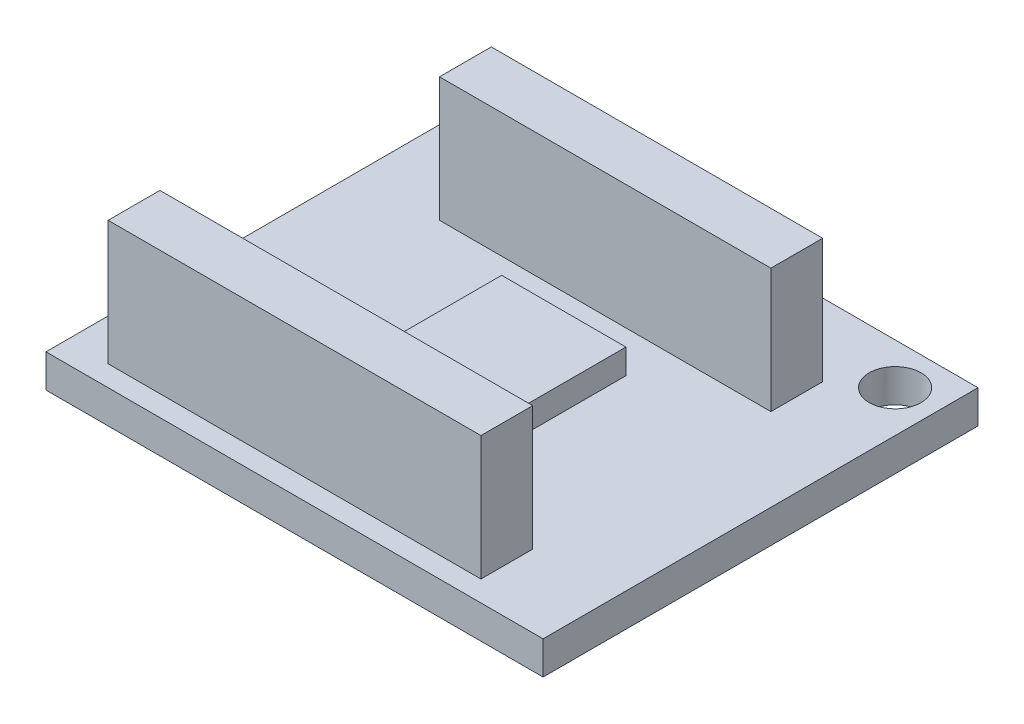
ISO-10303-21;
HEADER;
FILE_DESCRIPTION(('STEP AP214'),'2;1');
FILE_NAME('part.step','',(''),(''),'','','');
FILE_SCHEMA(('AUTOMOTIVE_DESIGN { 1 0 10303 214 1 1 1 1 }'));
ENDSEC;
DATA;
#1=APPLICATION_CONTEXT('core data for automotive mechanical design processes');
#2=APPLICATION_PROTOCOL_DEFINITION('international standard','automotive_design',2000,#1);
#3=PRODUCT_CONTEXT('',#1,'mechanical');
#4=PRODUCT('Part','Part','',(#3));
#5=PRODUCT_RELATED_PRODUCT_CATEGORY('part','',(#4));
#6=PRODUCT_DEFINITION_FORMATION('','',#4);
#7=PRODUCT_DEFINITION_CONTEXT('part definition',#1,'design');
#8=PRODUCT_DEFINITION('design','',#6,#7);
#9=PRODUCT_DEFINITION_SHAPE('','',#8);
#10=(LENGTH_UNIT() NAMED_UNIT(*) SI_UNIT(.MILLI.,.METRE.));
#11=(NAMED_UNIT(*) PLANE_ANGLE_UNIT() SI_UNIT($,.RADIAN.));
#12=(NAMED_UNIT(*) SI_UNIT($,.STERADIAN.) SOLID_ANGLE_UNIT());
#13=UNCERTAINTY_MEASURE_WITH_UNIT(LENGTH_MEASURE(1.E-05),#10,'distance_accuracy_value','');
#14=(GEOMETRIC_REPRESENTATION_CONTEXT(3) GLOBAL_UNCERTAINTY_ASSIGNED_CONTEXT((#13)) GLOBAL_UNIT_ASSIGNED_CONTEXT((#10,
#11,#12)) REPRESENTATION_CONTEXT('',''));
#15=CARTESIAN_POINT('',(0.,0.,0.));
#16=DIRECTION('',(0.,0.,1.));
#17=DIRECTION('',(1.,0.,0.));
#18=AXIS2_PLACEMENT_3D('',#15,#16,#17);
#19=CARTESIAN_POINT('',(0.,1.6,0.));
#20=DIRECTION('',(0.,-1.,0.));
#21=DIRECTION('',(0.,0.,-1.));
#22=AXIS2_PLACEMENT_3D('',#19,#20,#21);
#23=PLANE('',#22);
#24=DIRECTION('',(0.,0.,1.));
#25=VECTOR('',#24,1.);
#26=CARTESIAN_POINT('',(2.,1.6,-1.));
#27=LINE('',#26,#25);
#28=CARTESIAN_POINT('',(2.,1.6,-3.5));
#29=VERTEX_POINT('',#28);
#30=CARTESIAN_POINT('',(2.,1.6,-1.));
#31=VERTEX_POINT('',#30);
#32=EDGE_CURVE('E193',#29,#31,#27,.T.);
#33=ORIENTED_EDGE('',*,*,#32,.F.);
#34=DIRECTION('',(-1.,0.,0.));
#35=VECTOR('',#34,1.);
#36=CARTESIAN_POINT('',(2.,1.6,-3.5));
#37=LINE('',#36,#35);
#38=CARTESIAN_POINT('',(20.,1.6,-3.5));
#39=VERTEX_POINT('',#38);
#40=EDGE_CURVE('E210',#39,#29,#37,.T.);
#41=ORIENTED_EDGE('',*,*,#40,.F.);
#42=DIRECTION('',(0.,0.,-1.));
#43=VECTOR('',#42,1.);
#44=CARTESIAN_POINT('',(20.,1.6,-1.));
#45=LINE('',#44,#43);
#46=CARTESIAN_POINT('',(20.,1.6,-1.));
#47=VERTEX_POINT('',#46);
#48=EDGE_CURVE('E219',#47,#39,#45,.T.);
#49=ORIENTED_EDGE('',*,*,#48,.F.);
#50=DIRECTION('',(1.,0.,0.));
#51=VECTOR('',#50,1.);
#52=CARTESIAN_POINT('',(2.,1.6,-1.));
#53=LINE('',#52,#51);
#54=EDGE_CURVE('E198',#31,#47,#53,.T.);
#55=ORIENTED_EDGE('',*,*,#54,.F.);
#56=EDGE_LOOP('',(#33,#41,#49,#55));
#57=FACE_BOUND('',#56,.T.);
#58=DIRECTION('',(0.,0.,1.));
#59=VECTOR('',#58,1.);
#60=CARTESIAN_POINT('',(0.,1.6,0.));
#61=LINE('',#60,#59);
#62=CARTESIAN_POINT('',(0.,1.6,-21.));
#63=VERTEX_POINT('',#62);
#64=CARTESIAN_POINT('',(0.,1.6,0.));
#65=VERTEX_POINT('',#64);
#66=EDGE_CURVE('E306',#63,#65,#61,.T.);
#67=ORIENTED_EDGE('',*,*,#66,.T.);
#68=DIRECTION('',(1.,0.,0.));
#69=VECTOR('',#68,1.);
#70=CARTESIAN_POINT('',(0.,1.6,0.));
#71=LINE('',#70,#69);
#72=CARTESIAN_POINT('',(24.,1.6,0.));
#73=VERTEX_POINT('',#72);
#74=EDGE_CURVE('E382',#65,#73,#71,.T.);
#75=ORIENTED_EDGE('',*,*,#74,.T.);
#76=DIRECTION('',(0.,0.,-1.));
#77=VECTOR('',#76,1.);
#78=CARTESIAN_POINT('',(24.,1.6,0.));
#79=LINE('',#78,#77);
#80=CARTESIAN_POINT('',(24.,1.6,-21.));
#81=VERTEX_POINT('',#80);
#82=EDGE_CURVE('E356',#73,#81,#79,.T.);
#83=ORIENTED_EDGE('',*,*,#82,.T.);
#84=DIRECTION('',(-1.,0.,0.));
#85=VECTOR('',#84,1.);
#86=CARTESIAN_POINT('',(0.,1.6,-21.));
#87=LINE('',#86,#85);
#88=EDGE_CURVE('E374',#81,#63,#87,.T.);
#89=ORIENTED_EDGE('',*,*,#88,.T.);
#90=EDGE_LOOP('',(#67,#75,#83,#89));
#91=FACE_BOUND('',#90,.T.);
#92=CARTESIAN_POINT('',(2.,1.6,-19.));
#93=DIRECTION('',(0.,1.,0.));
#94=DIRECTION('',(0.,0.,1.));
#95=AXIS2_PLACEMENT_3D('',#92,#93,#94);
#96=CIRCLE('',#95,1.25);
#97=CARTESIAN_POINT('',(2.,1.6,-17.75));
#98=VERTEX_POINT('',#97);
#99=EDGE_CURVE('E293',#98,#98,#96,.T.);
#100=ORIENTED_EDGE('',*,*,#99,.F.);
#101=EDGE_LOOP('',(#100));
#102=FACE_BOUND('',#101,.T.);
#103=CARTESIAN_POINT('',(22.,1.6,-19.));
#104=DIRECTION('',(0.,1.,0.));
#105=DIRECTION('',(0.,0.,1.));
#106=AXIS2_PLACEMENT_3D('',#103,#104,#105);
#107=CIRCLE('',#106,1.25);
#108=CARTESIAN_POINT('',(22.,1.6,-17.75));
#109=VERTEX_POINT('',#108);
#110=EDGE_CURVE('E290',#109,#109,#107,.T.);
#111=ORIENTED_EDGE('',*,*,#110,.F.);
#112=EDGE_LOOP('',(#111));
#113=FACE_BOUND('',#112,.T.);
#114=DIRECTION('',(0.,0.,1.));
#115=VECTOR('',#114,1.);
#116=CARTESIAN_POINT('',(9.,1.6,-8.));
#117=LINE('',#116,#115);
#118=CARTESIAN_POINT('',(9.,1.6,-13.));
#119=VERTEX_POINT('',#118);
#120=CARTESIAN_POINT('',(9.,1.6,-8.));
#121=VERTEX_POINT('',#120);
#122=EDGE_CURVE('E245',#119,#121,#117,.T.);
#123=ORIENTED_EDGE('',*,*,#122,.F.);
#124=DIRECTION('',(-1.,0.,0.));
#125=VECTOR('',#124,1.);
#126=CARTESIAN_POINT('',(9.,1.6,-13.));
#127=LINE('',#126,#125);
#128=CARTESIAN_POINT('',(15.,1.6,-13.));
#129=VERTEX_POINT('',#128);
#130=EDGE_CURVE('E246',#129,#119,#127,.T.);
#131=ORIENTED_EDGE('',*,*,#130,.F.);
#132=DIRECTION('',(0.,0.,-1.));
#133=VECTOR('',#132,1.);
#134=CARTESIAN_POINT('',(15.,1.6,-8.));
#135=LINE('',#134,#133);
#136=CARTESIAN_POINT('',(15.,1.6,-8.));
#137=VERTEX_POINT('',#136);
#138=EDGE_CURVE('E264',#137,#129,#135,.T.);
#139=ORIENTED_EDGE('',*,*,#138,.F.);
#140=DIRECTION('',(1.,0.,0.));
#141=VECTOR('',#140,1.);
#142=CARTESIAN_POINT('',(9.,1.6,-8.));
#143=LINE('',#142,#141);
#144=EDGE_CURVE('E261',#121,#137,#143,.T.);
#145=ORIENTED_EDGE('',*,*,#144,.F.);
#146=EDGE_LOOP('',(#123,#131,#139,#145));
#147=FACE_BOUND('',#146,.T.);
#148=DIRECTION('',(0.,0.,1.));
#149=VECTOR('',#148,1.);
#150=CARTESIAN_POINT('',(4.,1.6,-15.));
#151=LINE('',#150,#149);
#152=CARTESIAN_POINT('',(4.,1.6,-17.5));
#153=VERTEX_POINT('',#152);
#154=CARTESIAN_POINT('',(4.,1.6,-15.));
#155=VERTEX_POINT('',#154);
#156=EDGE_CURVE('E188',#153,#155,#151,.T.);
#157=ORIENTED_EDGE('',*,*,#156,.F.);
#158=DIRECTION('',(-1.,0.,0.));
#159=VECTOR('',#158,1.);
#160=CARTESIAN_POINT('',(4.,1.6,-17.5));
#161=LINE('',#160,#159);
#162=CARTESIAN_POINT('',(20.,1.6,-17.5));
#163=VERTEX_POINT('',#162);
#164=EDGE_CURVE('E186',#163,#153,#161,.T.);
#165=ORIENTED_EDGE('',*,*,#164,.F.);
#166=DIRECTION('',(0.,0.,-1.));
#167=VECTOR('',#166,1.);
#168=CARTESIAN_POINT('',(20.,1.6,-15.));
#169=LINE('',#168,#167);
#170=CARTESIAN_POINT('',(20.,1.6,-15.));
#171=VERTEX_POINT('',#170);
#172=EDGE_CURVE('E74',#171,#163,#169,.T.);
#173=ORIENTED_EDGE('',*,*,#172,.F.);
#174=DIRECTION('',(1.,0.,0.));
#175=VECTOR('',#174,1.);
#176=CARTESIAN_POINT('',(4.,1.6,-15.));
#177=LINE('',#176,#175);
#178=EDGE_CURVE('E69',#155,#171,#177,.T.);
#179=ORIENTED_EDGE('',*,*,#178,.F.);
#180=EDGE_LOOP('',(#157,#165,#173,#179));
#181=FACE_BOUND('',#180,.T.);
#182=ADVANCED_FACE('F47',(#57,#91,#102,#113,#147,#181),#23,.F.);
#183=CARTESIAN_POINT('',(0.,0.,0.));
#184=DIRECTION('',(0.,-1.,0.));
#185=DIRECTION('',(0.,0.,-1.));
#186=AXIS2_PLACEMENT_3D('',#183,#184,#185);
#187=PLANE('',#186);
#188=CARTESIAN_POINT('',(22.,0.,-19.));
#189=DIRECTION('',(0.,-1.,0.));
#190=DIRECTION('',(0.,0.,-1.));
#191=AXIS2_PLACEMENT_3D('',#188,#189,#190);
#192=CIRCLE('',#191,1.25);
#193=CARTESIAN_POINT('',(22.,0.,-20.25));
#194=VERTEX_POINT('',#193);
#195=EDGE_CURVE('E292',#194,#194,#192,.T.);
#196=ORIENTED_EDGE('',*,*,#195,.F.);
#197=EDGE_LOOP('',(#196));
#198=FACE_BOUND('',#197,.T.);
#199=DIRECTION('',(0.,0.,1.));
#200=VECTOR('',#199,1.);
#201=CARTESIAN_POINT('',(0.,0.,0.));
#202=LINE('',#201,#200);
#203=CARTESIAN_POINT('',(0.,0.,-21.));
#204=VERTEX_POINT('',#203);
#205=CARTESIAN_POINT('',(0.,0.,0.));
#206=VERTEX_POINT('',#205);
#207=EDGE_CURVE('E353',#204,#206,#202,.T.);
#208=ORIENTED_EDGE('',*,*,#207,.F.);
#209=DIRECTION('',(-1.,0.,0.));
#210=VECTOR('',#209,1.);
#211=CARTESIAN_POINT('',(0.,0.,-21.));
#212=LINE('',#211,#210);
#213=CARTESIAN_POINT('',(24.,0.,-21.));
#214=VERTEX_POINT('',#213);
#215=EDGE_CURVE('E365',#214,#204,#212,.T.);
#216=ORIENTED_EDGE('',*,*,#215,.F.);
#217=DIRECTION('',(0.,0.,-1.));
#218=VECTOR('',#217,1.);
#219=CARTESIAN_POINT('',(24.,0.,0.));
#220=LINE('',#219,#218);
#221=CARTESIAN_POINT('',(24.,0.,0.));
#222=VERTEX_POINT('',#221);
#223=EDGE_CURVE('E352',#222,#214,#220,.T.);
#224=ORIENTED_EDGE('',*,*,#223,.F.);
#225=DIRECTION('',(1.,0.,0.));
#226=VECTOR('',#225,1.);
#227=CARTESIAN_POINT('',(0.,0.,0.));
#228=LINE('',#227,#226);
#229=EDGE_CURVE('E344',#206,#222,#228,.T.);
#230=ORIENTED_EDGE('',*,*,#229,.F.);
#231=EDGE_LOOP('',(#208,#216,#224,#230));
#232=FACE_BOUND('',#231,.T.);
#233=CARTESIAN_POINT('',(2.,0.,-17.75));
#234=CARTESIAN_POINT('',(2.02137002946192,0.,-17.7499991957699));
#235=CARTESIAN_POINT('',(2.04274243906027,0.,-17.7504682806281));
#236=CARTESIAN_POINT('',(2.08509281000976,0.,-17.7523762540132));
#237=CARTESIAN_POINT('',(2.10607149957371,0.,-17.7537991360117));
#238=CARTESIAN_POINT('',(2.14763510370591,0.,-17.7576141758783));
#239=CARTESIAN_POINT('',(2.16822132073613,0.,-17.7599919965637));
#240=CARTESIAN_POINT('',(2.20899903625998,0.,-17.765714860919));
#241=CARTESIAN_POINT('',(2.22919226362843,0.,-17.7690475427681));
#242=CARTESIAN_POINT('',(2.26918370147696,0.,-17.7766781110649));
#243=CARTESIAN_POINT('',(2.28898384106428,0.,-17.7809658603084));
#244=CARTESIAN_POINT('',(2.32818891639215,0.,-17.7905042176213));
#245=CARTESIAN_POINT('',(2.34759572480794,0.,-17.7957471165693));
#246=CARTESIAN_POINT('',(2.38601425030229,0.,-17.8071932631187));
#247=CARTESIAN_POINT('',(2.4050274989413,0.,-17.8133913654376));
#248=CARTESIAN_POINT('',(2.44265930026506,0.,-17.8267452890162));
#249=CARTESIAN_POINT('',(2.46127874817616,0.,-17.8338985865133));
#250=CARTESIAN_POINT('',(2.498123643369,0.,-17.8491602416641));
#251=CARTESIAN_POINT('',(2.51634906130129,0.,-17.857268670173));
#252=CARTESIAN_POINT('',(2.55240687711702,0.,-17.8744379844398));
#253=CARTESIAN_POINT('',(2.57023805828487,0.,-17.883501424602));
#254=CARTESIAN_POINT('',(2.60550863572637,0.,-17.9025783016175));
#255=CARTESIAN_POINT('',(2.62294540727884,0.,-17.9125965882938));
#256=CARTESIAN_POINT('',(2.65742861115004,0.,-17.9335809093636));
#257=CARTESIAN_POINT('',(2.67447084533492,0.,-17.9445538367691));
#258=CARTESIAN_POINT('',(2.70816656099314,0.,-17.967445482461));
#259=CARTESIAN_POINT('',(2.72481416864408,0.,-17.9793728380707));
#260=CARTESIAN_POINT('',(2.75772233527551,0.,-18.0041716376304));
#261=CARTESIAN_POINT('',(2.77397530855567,0.,-18.0170531359271));
#262=CARTESIAN_POINT('',(2.8060958037435,0.,-18.0437590925732));
#263=CARTESIAN_POINT('',(2.82195405239176,0.,-18.0575946906932));
#264=CARTESIAN_POINT('',(2.85328713183001,0.,-18.0862071550063));
#265=CARTESIAN_POINT('',(2.86875109081304,0.,-18.100995905861));
#266=CARTESIAN_POINT('',(2.89899507659122,0.,-18.1312163717749));
#267=CARTESIAN_POINT('',(2.9137760136466,0.,-18.1466471757683));
#268=CARTESIAN_POINT('',(2.9423731623832,0.,-18.1779191058513));
#269=CARTESIAN_POINT('',(2.95620119255272,0.,-18.1937494048128));
#270=CARTESIAN_POINT('',(2.98289346628216,0.,-18.2258180425323));
#271=CARTESIAN_POINT('',(2.99576874603216,0.,-18.2420471846162));
#272=CARTESIAN_POINT('',(3.02055628843086,0.,-18.274912004227));
#273=CARTESIAN_POINT('',(3.0324784846125,0.,-18.2915401806713));
#274=CARTESIAN_POINT('',(3.05536108978226,0.,-18.3252012623155));
#275=CARTESIAN_POINT('',(3.06632999233453,0.,-18.3422283879342));
#276=CARTESIAN_POINT('',(3.08730754384401,0.,-18.3766856149396));
#277=CARTESIAN_POINT('',(3.09732292075549,0.,-18.3941116170216));
#278=CARTESIAN_POINT('',(3.11639528470281,0.,-18.4293648869149));
#279=CARTESIAN_POINT('',(3.12545693690491,0.,-18.4471896293591));
#280=CARTESIAN_POINT('',(3.14262399890167,0.,-18.4832388012999));
#281=CARTESIAN_POINT('',(3.15073176221156,0.,-18.501462109676));
#282=CARTESIAN_POINT('',(3.16599342579688,0.,-18.5383070242734));
#283=CARTESIAN_POINT('',(3.17314718433669,0.,-18.5569286892023));
#284=CARTESIAN_POINT('',(3.18650337862859,0.,-18.5945691715312));
#285=CARTESIAN_POINT('',(3.19270307175115,0.,-18.6135889617007));
#286=CARTESIAN_POINT('',(3.20415375274262,0.,-18.6520248309165));
#287=CARTESIAN_POINT('',(3.20939937605177,0.,-18.6714425066537));
#288=CARTESIAN_POINT('',(3.21894453327252,0.,-18.7106735829573));
#289=CARTESIAN_POINT('',(3.22323614419258,0.,-18.7304889081166));
#290=CARTESIAN_POINT('',(3.23087577915527,0.,-18.7705150260097));
#291=CARTESIAN_POINT('',(3.2342134628191,0.,-18.7907277872911));
#292=CARTESIAN_POINT('',(3.23994766313957,0.,-18.8315487831286));
#293=CARTESIAN_POINT('',(3.24233162994327,0.,-18.852158773267));
#294=CARTESIAN_POINT('',(3.24616027187901,0.,-18.8937745634038));
#295=CARTESIAN_POINT('',(3.24759044005038,0.,-18.9147816891753));
#296=CARTESIAN_POINT('',(3.24951429916744,0.,-18.9571919944877));
#297=CARTESIAN_POINT('',(3.24999183478982,0.,-18.9785958927403));
#298=CARTESIAN_POINT('',(3.25000814942155,0.,-19.0213627192932));
#299=CARTESIAN_POINT('',(3.24954874186838,0.,-19.042725646786));
#300=CARTESIAN_POINT('',(3.24765747039473,0.,-19.0850594787803));
#301=CARTESIAN_POINT('',(3.24624162177909,0.,-19.1060310842902));
#302=CARTESIAN_POINT('',(3.24243993619667,0.,-19.1475813231457));
#303=CARTESIAN_POINT('',(3.2400684054626,0.,-19.168161257223));
#304=CARTESIAN_POINT('',(3.23435691379118,0.,-19.2089276333773));
#305=CARTESIAN_POINT('',(3.23102928111486,0.,-19.2291157954571));
#306=CARTESIAN_POINT('',(3.22340774577498,0.,-19.2690982198298));
#307=CARTESIAN_POINT('',(3.21912393572213,0.,-19.2888944011983));
#308=CARTESIAN_POINT('',(3.20959236617655,0.,-19.3280927090016));
#309=CARTESIAN_POINT('',(3.20435226271755,0.,-19.3474966941724));
#310=CARTESIAN_POINT('',(3.19291063428961,0.,-19.3859107182529));
#311=CARTESIAN_POINT('',(3.18671419379461,0.,-19.4049222702291));
#312=CARTESIAN_POINT('',(3.17336252583883,0.,-19.4425518301157));
#313=CARTESIAN_POINT('',(3.16620975531659,0.,-19.4611707094607));
#314=CARTESIAN_POINT('',(3.15094809215821,0.,-19.4980156242381));
#315=CARTESIAN_POINT('',(3.14283905778728,0.,-19.5162416009608));
#316=CARTESIAN_POINT('',(3.12566747304208,0.,-19.5523016968174));
#317=CARTESIAN_POINT('',(3.116602295484,0.,-19.5701345644712));
#318=CARTESIAN_POINT('',(3.09752088589846,0.,-19.6054096824127));
#319=CARTESIAN_POINT('',(3.08749973152344,0.,-19.6228492684148));
#320=CARTESIAN_POINT('',(3.06650861683442,0.,-19.6573392739005));
#321=CARTESIAN_POINT('',(3.0555316932266,0.,-19.6743854518759));
#322=CARTESIAN_POINT('',(3.0326309915277,0.,-19.7080902289505));
#323=CARTESIAN_POINT('',(3.02069850971128,0.,-19.7247429082712));
#324=CARTESIAN_POINT('',(2.99588839867111,0.,-19.7576624031739));
#325=CARTESIAN_POINT('',(2.98300065397711,0.,-19.7739215860539));
#326=CARTESIAN_POINT('',(2.95628110524247,0.,-19.8060556521395));
#327=CARTESIAN_POINT('',(2.94243810576841,0.,-19.821921214838));
#328=CARTESIAN_POINT('',(2.9138098651176,0.,-19.8532702031442));
#329=CARTESIAN_POINT('',(2.89901269219624,0.,-19.8687427134192));
#330=CARTESIAN_POINT('',(2.86878351531764,0.,-19.8989949626712));
#331=CARTESIAN_POINT('',(2.85335279422534,0.,-19.9137759833711));
#332=CARTESIAN_POINT('',(2.8220809236645,0.,-19.9423731921637));
#333=CARTESIAN_POINT('',(2.80625060303885,0.,-19.9562012004748));
#334=CARTESIAN_POINT('',(2.774181949729,0.,-19.9828934584741));
#335=CARTESIAN_POINT('',(2.75795281332272,0.,-19.9957687439526));
#336=CARTESIAN_POINT('',(2.72508799780806,0.,-20.0205562904842));
#337=CARTESIAN_POINT('',(2.70845981987104,0.,-20.0324784851597));
#338=CARTESIAN_POINT('',(2.67479873714702,0.,-20.0553610892399));
#339=CARTESIAN_POINT('',(2.65777161192207,0.,-20.0663299921895));
#340=CARTESIAN_POINT('',(2.62331438520229,0.,-20.0873075439872));
#341=CARTESIAN_POINT('',(2.60588838301604,0.,-20.0973229207935));
#342=CARTESIAN_POINT('',(2.57063511304684,0.,-20.1163952846642));
#343=CARTESIAN_POINT('',(2.55281037063032,0.,-20.1254569368943));
#344=CARTESIAN_POINT('',(2.51676119870979,0.,-20.1426239989114));
#345=CARTESIAN_POINT('',(2.49853789032627,0.,-20.1507317622139));
#346=CARTESIAN_POINT('',(2.46169297572346,0.,-20.1659934257937));
#347=CARTESIAN_POINT('',(2.44307131079653,0.,-20.1731471843355));
#348=CARTESIAN_POINT('',(2.40543082846907,0.,-20.1865033786289));
#349=CARTESIAN_POINT('',(2.38641103829909,0.,-20.1927030717509));
#350=CARTESIAN_POINT('',(2.34797516908295,0.,-20.204153752742));
#351=CARTESIAN_POINT('',(2.32855749334585,0.,-20.2093993760513));
#352=CARTESIAN_POINT('',(2.28932641704245,0.,-20.2189445332722));
#353=CARTESIAN_POINT('',(2.26951109188312,0.,-20.2232361441923));
#354=CARTESIAN_POINT('',(2.22948497399001,0.,-20.2308757791549));
#355=CARTESIAN_POINT('',(2.20927221270861,0.,-20.2342134628188));
#356=CARTESIAN_POINT('',(2.16845121687116,0.,-20.2399476631393));
#357=CARTESIAN_POINT('',(2.14784122673279,0.,-20.2423316299431));
#358=CARTESIAN_POINT('',(2.10622543659604,0.,-20.2461602718788));
#359=CARTESIAN_POINT('',(2.08521831082452,0.,-20.2475904400502));
#360=CARTESIAN_POINT('',(2.0428080055122,0.,-20.2495142991674));
#361=CARTESIAN_POINT('',(2.02140410725965,0.,-20.2499918347898));
#362=CARTESIAN_POINT('',(1.97863728070688,0.,-20.2500081494216));
#363=CARTESIAN_POINT('',(1.95727435321416,0.,-20.2495487418684));
#364=CARTESIAN_POINT('',(1.91494052121999,0.,-20.2476574703949));
#365=CARTESIAN_POINT('',(1.89396891571015,0.,-20.2462416217793));
#366=CARTESIAN_POINT('',(1.8524186768548,0.,-20.2424399361969));
#367=CARTESIAN_POINT('',(1.83183874277755,0.,-20.2400684054628));
#368=CARTESIAN_POINT('',(1.79107236662332,0.,-20.2343569137915));
#369=CARTESIAN_POINT('',(1.77088420454357,0.,-20.2310292811152));
#370=CARTESIAN_POINT('',(1.73090178017103,0.,-20.2234077457753));
#371=CARTESIAN_POINT('',(1.71110559880256,0.,-20.2191239357225));
#372=CARTESIAN_POINT('',(1.67190729099929,0.,-20.2095923661769));
#373=CARTESIAN_POINT('',(1.65250330582857,0.,-20.2043522627179));
#374=CARTESIAN_POINT('',(1.6140892817481,0.,-20.19291063429));
#375=CARTESIAN_POINT('',(1.59507772977185,0.,-20.186714193795));
#376=CARTESIAN_POINT('',(1.55744816988531,0.,-20.1733625258393));
#377=CARTESIAN_POINT('',(1.53882929054027,0.,-20.166209755317));
#378=CARTESIAN_POINT('',(1.50198437576287,0.,-20.1509480921586));
#379=CARTESIAN_POINT('',(1.48375839904017,0.,-20.1428390577877));
#380=CARTESIAN_POINT('',(1.4476983031836,0.,-20.1256674730425));
#381=CARTESIAN_POINT('',(1.42986543552979,0.,-20.1166022954844));
#382=CARTESIAN_POINT('',(1.39459031758824,0.,-20.0975208858988));
#383=CARTESIAN_POINT('',(1.37715073158609,0.,-20.0874997315238));
#384=CARTESIAN_POINT('',(1.34266072610031,0.,-20.0665086168348));
#385=CARTESIAN_POINT('',(1.32561454812494,0.,-20.0555316932269));
#386=CARTESIAN_POINT('',(1.29190977105022,0.,-20.032630991528));
#387=CARTESIAN_POINT('',(1.27525709172945,0.,-20.0206985097116));
#388=CARTESIAN_POINT('',(1.24233759682665,0.,-19.9958883986714));
#389=CARTESIAN_POINT('',(1.22607841394657,0.,-19.9830006539773));
#390=CARTESIAN_POINT('',(1.19394434786086,0.,-19.9562811052426));
#391=CARTESIAN_POINT('',(1.17807878516233,0.,-19.9424381057685));
#392=CARTESIAN_POINT('',(1.14672979685599,0.,-19.9138098651177));
#393=CARTESIAN_POINT('',(1.13125728658089,0.,-19.8990126921963));
#394=CARTESIAN_POINT('',(1.10100503732878,0.,-19.8687835153176));
#395=CARTESIAN_POINT('',(1.08622401662881,0.,-19.8533527942253));
#396=CARTESIAN_POINT('',(1.05762680783613,0.,-19.8220809236645));
#397=CARTESIAN_POINT('',(1.04379879952497,0.,-19.8062506030389));
#398=CARTESIAN_POINT('',(1.01710654152563,0.,-19.774181949729));
#399=CARTESIAN_POINT('',(1.00423125604706,0.,-19.7579528133227));
#400=CARTESIAN_POINT('',(0.979443709515487,0.,-19.7250879978081));
#401=CARTESIAN_POINT('',(0.967521514839911,0.,-19.7084598198711));
#402=CARTESIAN_POINT('',(0.944638910759649,0.,-19.6747987371471));
#403=CARTESIAN_POINT('',(0.933670007810063,0.,-19.6577716119221));
#404=CARTESIAN_POINT('',(0.912692456012328,0.,-19.6233143852023));
#405=CARTESIAN_POINT('',(0.902677079206035,0.,-19.6058883830161));
#406=CARTESIAN_POINT('',(0.883604715335262,0.,-19.5706351130469));
#407=CARTESIAN_POINT('',(0.874543063105201,0.,-19.5528103706304));
#408=CARTESIAN_POINT('',(0.857376001088032,0.,-19.5167611987098));
#409=CARTESIAN_POINT('',(0.849268237785602,0.,-19.4985378903263));
#410=CARTESIAN_POINT('',(0.834006574205744,0.,-19.4616929757235));
#411=CARTESIAN_POINT('',(0.826852815663934,0.,-19.4430713107966));
#412=CARTESIAN_POINT('',(0.813496621370577,0.,-19.4054308284691));
#413=CARTESIAN_POINT('',(0.807296928248554,0.,-19.3864110382991));
#414=CARTESIAN_POINT('',(0.795846247257485,0.,-19.347975169083));
#415=CARTESIAN_POINT('',(0.790600623948191,0.,-19.3285574933459));
#416=CARTESIAN_POINT('',(0.781055466727338,0.,-19.2893264170425));
#417=CARTESIAN_POINT('',(0.776763855807318,0.,-19.2695110918832));
#418=CARTESIAN_POINT('',(0.76912422084467,0.,-19.22948497399));
#419=CARTESIAN_POINT('',(0.76578653718083,0.,-19.2092722127086));
#420=CARTESIAN_POINT('',(0.760052336860371,0.,-19.1684512168712));
#421=CARTESIAN_POINT('',(0.757668370056672,0.,-19.1478412267328));
#422=CARTESIAN_POINT('',(0.75383972812095,0.,-19.1062254365961));
#423=CARTESIAN_POINT('',(0.752409559949588,0.,-19.0852183108245));
#424=CARTESIAN_POINT('',(0.750485700832544,0.,-19.0428080055122));
#425=CARTESIAN_POINT('',(0.750008165210172,0.,-19.0214041072597));
#426=CARTESIAN_POINT('',(0.749991850578454,0.,-18.9786372807068));
#427=CARTESIAN_POINT('',(0.750451258131636,0.,-18.957274353214));
#428=CARTESIAN_POINT('',(0.752342529605305,0.,-18.9149405212197));
#429=CARTESIAN_POINT('',(0.753758378220948,0.,-18.8939689157098));
#430=CARTESIAN_POINT('',(0.757560063803377,0.,-18.8524186768543));
#431=CARTESIAN_POINT('',(0.759931594537458,0.,-18.831838742777));
#432=CARTESIAN_POINT('',(0.765643086208892,0.,-18.7910723666227));
#433=CARTESIAN_POINT('',(0.768970718885232,0.,-18.7708842045429));
#434=CARTESIAN_POINT('',(0.776592254225094,0.,-18.7309017801702));
#435=CARTESIAN_POINT('',(0.780876064277906,0.,-18.7111055988017));
#436=CARTESIAN_POINT('',(0.790407633823596,0.,-18.6719072909984));
#437=CARTESIAN_POINT('',(0.795647737282749,0.,-18.6525033058278));
#438=CARTESIAN_POINT('',(0.807089365710298,0.,-18.6140892817469));
#439=CARTESIAN_POINT('',(0.813285806204758,0.,-18.5950777297701));
#440=CARTESIAN_POINT('',(0.826637474162011,0.,-18.557448169885));
#441=CARTESIAN_POINT('',(0.833790244686258,0.,-18.538829290542));
#442=CARTESIAN_POINT('',(0.849051907839152,0.,-18.5019843757591));
#443=CARTESIAN_POINT('',(0.857160942202579,0.,-18.483758399029));
#444=CARTESIAN_POINT('',(0.874332526968297,0.,-18.4476983031928));
#445=CARTESIAN_POINT('',(0.883397704554502,0.,-18.4298654355668));
#446=CARTESIAN_POINT('',(0.902479114063027,0.,-18.3945903175491));
#447=CARTESIAN_POINT('',(0.912500268332194,0.,-18.3771507314423));
#448=CARTESIAN_POINT('',(0.933491383311295,0.,-18.3426607262435));
#449=CARTESIAN_POINT('',(0.944468307319088,0.,-18.3256145486639));
#450=CARTESIAN_POINT('',(0.967369007921071,0.,-18.2919097705041));
#451=CARTESIAN_POINT('',(0.979301488220712,0.,-18.2752570896827));
#452=CARTESIAN_POINT('',(1.00411160342341,0.,-18.2423375988983));
#453=CARTESIAN_POINT('',(1.01699935388877,0.,-18.2260784217282));
#454=CARTESIAN_POINT('',(1.04371888677467,0.,-18.1939443399625));
#455=CARTESIAN_POINT('',(1.0575618642197,0.,-18.1780787554694));
#456=CARTESIAN_POINT('',(1.08619016539912,0.,-18.1467298270478));
#457=CARTESIAN_POINT('',(1.10098742264341,0.,-18.1312574001986));
#458=CARTESIAN_POINT('',(1.13122486506607,0.,-18.1009964223173));
#459=CARTESIAN_POINT('',(1.14666414019389,0.,-18.0862069620395));
#460=CARTESIAN_POINT('',(1.17795192512668,0.,-18.0575939446989));
#461=CARTESIAN_POINT('',(1.19378956220485,0.,-18.0437585200141));
#462=CARTESIAN_POINT('',(1.22587179110464,0.,-18.017052642374));
#463=CARTESIAN_POINT('',(1.24210713916258,0.,-18.0041710977349));
#464=CARTESIAN_POINT('',(1.27498328690652,0.,-17.9793722167461));
#465=CARTESIAN_POINT('',(1.29161653818806,0.,-17.96744488539));
#466=CARTESIAN_POINT('',(1.32528668550262,0.,-17.944553206898));
#467=CARTESIAN_POINT('',(1.34231775583977,0.,-17.9335802995813));
#468=CARTESIAN_POINT('',(1.37678178658896,0.,-17.9125959403458));
#469=CARTESIAN_POINT('',(1.39421060419152,0.,-17.9025776899908));
#470=CARTESIAN_POINT('',(1.42946841628901,0.,-17.8835007843278));
#471=CARTESIAN_POINT('',(1.44729484578116,0.,-17.8744373911935));
#472=CARTESIAN_POINT('',(1.4833462986378,0.,-17.8572680540464));
#473=CARTESIAN_POINT('',(1.50157016609277,0.,-17.8491596836785));
#474=CARTESIAN_POINT('',(1.53841510022093,0.,-17.8338980121368));
#475=CARTESIAN_POINT('',(1.55703619625336,0.,-17.8267447818433));
#476=CARTESIAN_POINT('',(1.59467443691401,0.,-17.8133908474594));
#477=CARTESIAN_POINT('',(1.61369253055529,0.,-17.8071928192823));
#478=CARTESIAN_POINT('',(1.65212389498052,0.,-17.7957466666575));
#479=CARTESIAN_POINT('',(1.67153874398265,0.,-17.7905038461556));
#480=CARTESIAN_POINT('',(1.71076305739299,0.,-17.7809654864466));
#481=CARTESIAN_POINT('',(1.73057443257987,0.,-17.7766778173343));
#482=CARTESIAN_POINT('',(1.7705915074995,0.,-17.7690472489322));
#483=CARTESIAN_POINT('',(1.79079916528849,0.,-17.7657146459803));
#484=CARTESIAN_POINT('',(1.83160891774553,0.,-17.759991783524));
#485=CARTESIAN_POINT('',(1.85221276130255,0.,-17.7576140393595));
#486=CARTESIAN_POINT('',(1.89381480086514,0.,-17.753798999181));
#487=CARTESIAN_POINT('',(1.91481431113772,0.,-17.7523761850569));
#488=CARTESIAN_POINT('',(1.95720952491001,0.,-17.7504682203432));
#489=CARTESIAN_POINT('',(1.97860596198845,0.,-17.7499992099384));
#490=CARTESIAN_POINT('',(2.,0.,-17.75));
#491=B_SPLINE_CURVE_WITH_KNOTS('',3,(#233,#234,#235,#236,#237,#238,#239,#240,#241,#242,#243,
#244,#245,#246,#247,#248,#249,#250,#251,#252,#253,#254,#255,#256,#257,#258,#259,#260,#261,#262,
#263,#264,#265,#266,#267,#268,#269,#270,#271,#272,#273,#274,#275,#276,#277,#278,#279,#280,#281,
#282,#283,#284,#285,#286,#287,#288,#289,#290,#291,#292,#293,#294,#295,#296,#297,#298,#299,#300,
#301,#302,#303,#304,#305,#306,#307,#308,#309,#310,#311,#312,#313,#314,#315,#316,#317,#318,#319,
#320,#321,#322,#323,#324,#325,#326,#327,#328,#329,#330,#331,#332,#333,#334,#335,#336,#337,#338,
#339,#340,#341,#342,#343,#344,#345,#346,#347,#348,#349,#350,#351,#352,#353,#354,#355,#356,#357,
#358,#359,#360,#361,#362,#363,#364,#365,#366,#367,#368,#369,#370,#371,#372,#373,#374,#375,#376,
#377,#378,#379,#380,#381,#382,#383,#384,#385,#386,#387,#388,#389,#390,#391,#392,#393,#394,#395,
#396,#397,#398,#399,#400,#401,#402,#403,#404,#405,#406,#407,#408,#409,#410,#411,#412,#413,#414,
#415,#416,#417,#418,#419,#420,#421,#422,#423,#424,#425,#426,#427,#428,#429,#430,#431,#432,#433,
#434,#435,#436,#437,#438,#439,#440,#441,#442,#443,#444,#445,#446,#447,#448,#449,#450,#451,#452,
#453,#454,#455,#456,#457,#458,#459,#460,#461,#462,#463,#464,#465,#466,#467,#468,#469,#470,#471,
#472,#473,#474,#475,#476,#477,#478,#479,#480,#481,#482,#483,#484,#485,#486,#487,#488,#489,#490),
.UNSPECIFIED.,.F.,.F.,(4,2,2,2,2,2,2,2,2,2,2,2,2,2,2,2,2,2,2,2,2,2,2,2,2,2,2,2,2,2,2,2,2,2,2,2,
2,2,2,2,2,2,2,2,2,2,2,2,2,2,2,2,2,2,2,2,2,2,2,2,2,2,2,2,2,2,2,2,2,2,2,2,2,2,2,2,2,2,2,2,2,2,2,2,
2,2,2,2,2,2,2,2,2,2,2,2,2,2,2,2,2,2,2,2,2,2,2,2,2,2,2,2,2,2,2,2,2,2,2,2,2,2,2,2,2,2,2,2,4),(0.,
0.0641083838299686,0.127166979030335,0.189312252893982,0.250686765373698,0.311438502667776,
0.37172003773421,0.431687532589954,0.491499609064299,0.551316125417749,0.61129690441189,
0.671600462784642,0.73238279195751,0.793796235197023,0.855988498099879,0.919101818429379,
0.983272309503089,1.04735465718971,1.11038972357781,1.17251429065952,1.23387123001152,
1.29460883046804,1.35487995243208,1.41484102403197,1.4746509061839,1.53446966435944,
1.59445729297832,1.65477244261742,1.71557119997044,1.77700596574987,1.83922446724333,
1.90236893129858,1.9665754316282,2.03065777931499,2.09369284570324,2.15581741278508,
2.21717435213718,2.27791195259379,2.33818307455789,2.39814414615782,2.45795402830976,
2.51777278648529,2.57776041510414,2.63807556474317,2.6988743220961,2.76030908787542,
2.82252758936875,2.88567205342385,2.94987855375329,3.01396090143992,3.07699596782802,
3.13912053490975,3.20047747426176,3.26121507471829,3.32148619668234,3.38144726828224,
3.44125715043418,3.50107590860972,3.56106353722859,3.62137868686766,3.68217744422064,
3.74361221000002,3.80583071149341,3.86897517554859,3.93318167587811,3.99726402356466,
4.06029908995269,4.12242365703435,4.18378059638631,4.2445181968428,4.30478931880681,
4.36475039040669,4.42456027255861,4.48437903073416,4.54436665935306,4.60468180899217,
4.66548056634523,4.7269153321247,4.78913383361821,4.85227829767353,4.91648479800321,
4.98056714568991,5.04360221207808,5.10572677915985,5.1670837185119,5.22782131896846,
5.28809244093253,5.34805351253244,5.40786339468437,5.46768215285991,5.52766978147878,
5.58798493111784,5.64878368847082,5.71021845425019,5.77243695574358,5.83558141979877,
5.89978792012829,5.96387026781509,6.02690533420333,6.08902990128517,6.15038684063728,
6.2111244410939,6.27139556305799,6.33135663465793,6.39116651680987,6.4509852749854,
6.51097290360424,6.57128805324327,6.6320868105962,6.69352157637551,6.75574007786882,
6.81888454192391,6.88309104225333,6.94720944193722,7.01027568859659,7.07242652435984,
7.13380480987786,7.1945588559068,7.25484158074012,7.31480950838872,7.37462163431896,
7.43443819639683,7.49441939693522,7.55472412615218,7.61550873721885,7.6769259184291,
7.73912369959363,7.8022446188238,7.86642506394397),.UNSPECIFIED.);
#492=CARTESIAN_POINT('',(2.,0.,-17.75));
#493=VERTEX_POINT('',#492);
#494=EDGE_CURVE('E298',#493,#493,#491,.T.);
#495=ORIENTED_EDGE('',*,*,#494,.T.);
#496=EDGE_LOOP('',(#495));
#497=FACE_BOUND('',#496,.T.);
#498=ADVANCED_FACE('F322',(#198,#232,#497),#187,.T.);
#499=CARTESIAN_POINT('',(0.,1.6,0.));
#500=DIRECTION('',(1.,0.,0.));
#501=DIRECTION('',(0.,0.,-1.));
#502=AXIS2_PLACEMENT_3D('',#499,#500,#501);
#503=PLANE('',#502);
#504=ORIENTED_EDGE('',*,*,#207,.T.);
#505=DIRECTION('',(0.,-1.,0.));
#506=VECTOR('',#505,1.);
#507=CARTESIAN_POINT('',(0.,1.6,0.));
#508=LINE('',#507,#506);
#509=EDGE_CURVE('E11',#65,#206,#508,.T.);
#510=ORIENTED_EDGE('',*,*,#509,.F.);
#511=ORIENTED_EDGE('',*,*,#66,.F.);
#512=DIRECTION('',(0.,-1.,0.));
#513=VECTOR('',#512,1.);
#514=CARTESIAN_POINT('',(0.,1.6,-21.));
#515=LINE('',#514,#513);
#516=EDGE_CURVE('E371',#63,#204,#515,.T.);
#517=ORIENTED_EDGE('',*,*,#516,.T.);
#518=EDGE_LOOP('',(#504,#510,#511,#517));
#519=FACE_BOUND('',#518,.T.);
#520=ADVANCED_FACE('F51',(#519),#503,.F.);
#521=CARTESIAN_POINT('',(0.,1.6,0.));
#522=DIRECTION('',(0.,0.,-1.));
#523=DIRECTION('',(-1.,0.,0.));
#524=AXIS2_PLACEMENT_3D('',#521,#522,#523);
#525=PLANE('',#524);
#526=ORIENTED_EDGE('',*,*,#229,.T.);
#527=DIRECTION('',(0.,-1.,0.));
#528=VECTOR('',#527,1.);
#529=CARTESIAN_POINT('',(24.,1.6,0.));
#530=LINE('',#529,#528);
#531=EDGE_CURVE('E61',#73,#222,#530,.T.);
#532=ORIENTED_EDGE('',*,*,#531,.F.);
#533=ORIENTED_EDGE('',*,*,#74,.F.);
#534=ORIENTED_EDGE('',*,*,#509,.T.);
#535=EDGE_LOOP('',(#526,#532,#533,#534));
#536=FACE_BOUND('',#535,.T.);
#537=ADVANCED_FACE('F333',(#536),#525,.F.);
#538=CARTESIAN_POINT('',(24.,1.6,0.));
#539=DIRECTION('',(-1.,0.,0.));
#540=DIRECTION('',(0.,0.,1.));
#541=AXIS2_PLACEMENT_3D('',#538,#539,#540);
#542=PLANE('',#541);
#543=ORIENTED_EDGE('',*,*,#223,.T.);
#544=DIRECTION('',(0.,-1.,0.));
#545=VECTOR('',#544,1.);
#546=CARTESIAN_POINT('',(24.,1.6,-21.));
#547=LINE('',#546,#545);
#548=EDGE_CURVE('E357',#81,#214,#547,.T.);
#549=ORIENTED_EDGE('',*,*,#548,.F.);
#550=ORIENTED_EDGE('',*,*,#82,.F.);
#551=ORIENTED_EDGE('',*,*,#531,.T.);
#552=EDGE_LOOP('',(#543,#549,#550,#551));
#553=FACE_BOUND('',#552,.T.);
#554=ADVANCED_FACE('F335',(#553),#542,.F.);
#555=CARTESIAN_POINT('',(0.,1.6,-21.));
#556=DIRECTION('',(0.,0.,1.));
#557=DIRECTION('',(1.,0.,0.));
#558=AXIS2_PLACEMENT_3D('',#555,#556,#557);
#559=PLANE('',#558);
#560=ORIENTED_EDGE('',*,*,#215,.T.);
#561=ORIENTED_EDGE('',*,*,#516,.F.);
#562=ORIENTED_EDGE('',*,*,#88,.F.);
#563=ORIENTED_EDGE('',*,*,#548,.T.);
#564=EDGE_LOOP('',(#560,#561,#562,#563));
#565=FACE_BOUND('',#564,.T.);
#566=ADVANCED_FACE('F321',(#565),#559,.F.);
#567=CARTESIAN_POINT('',(2.,-1.2E-05,-19.));
#568=DIRECTION('',(0.,1.,0.));
#569=DIRECTION('',(0.,0.,1.));
#570=AXIS2_PLACEMENT_3D('',#567,#568,#569);
#571=CYLINDRICAL_SURFACE('',#570,1.25);
#572=ORIENTED_EDGE('',*,*,#494,.F.);
#573=EDGE_LOOP('',(#572));
#574=FACE_BOUND('',#573,.T.);
#575=ORIENTED_EDGE('',*,*,#99,.T.);
#576=EDGE_LOOP('',(#575));
#577=FACE_BOUND('',#576,.T.);
#578=ADVANCED_FACE('F309',(#574,#577),#571,.F.);
#579=CARTESIAN_POINT('',(22.,-0.0740303994959636,-19.));
#580=DIRECTION('',(0.,1.,0.));
#581=DIRECTION('',(0.,0.,1.));
#582=AXIS2_PLACEMENT_3D('',#579,#580,#581);
#583=CYLINDRICAL_SURFACE('',#582,1.25);
#584=ORIENTED_EDGE('',*,*,#195,.T.);
#585=EDGE_LOOP('',(#584));
#586=FACE_BOUND('',#585,.T.);
#587=ORIENTED_EDGE('',*,*,#110,.T.);
#588=EDGE_LOOP('',(#587));
#589=FACE_BOUND('',#588,.T.);
#590=ADVANCED_FACE('F319',(#586,#589),#583,.F.);
#591=CARTESIAN_POINT('',(9.,2.8,-8.));
#592=DIRECTION('',(1.,0.,0.));
#593=DIRECTION('',(0.,0.,-1.));
#594=AXIS2_PLACEMENT_3D('',#591,#592,#593);
#595=PLANE('',#594);
#596=ORIENTED_EDGE('',*,*,#122,.T.);
#597=DIRECTION('',(0.,-1.,0.));
#598=VECTOR('',#597,1.);
#599=CARTESIAN_POINT('',(9.,2.8,-8.));
#600=LINE('',#599,#598);
#601=CARTESIAN_POINT('',(9.,2.8,-8.));
#602=VERTEX_POINT('',#601);
#603=EDGE_CURVE('E282',#602,#121,#600,.T.);
#604=ORIENTED_EDGE('',*,*,#603,.F.);
#605=DIRECTION('',(0.,0.,1.));
#606=VECTOR('',#605,1.);
#607=CARTESIAN_POINT('',(9.,2.8,-8.));
#608=LINE('',#607,#606);
#609=CARTESIAN_POINT('',(9.,2.8,-13.));
#610=VERTEX_POINT('',#609);
#611=EDGE_CURVE('E242',#610,#602,#608,.T.);
#612=ORIENTED_EDGE('',*,*,#611,.F.);
#613=DIRECTION('',(0.,-1.,0.));
#614=VECTOR('',#613,1.);
#615=CARTESIAN_POINT('',(9.,2.8,-13.));
#616=LINE('',#615,#614);
#617=EDGE_CURVE('E260',#610,#119,#616,.T.);
#618=ORIENTED_EDGE('',*,*,#617,.T.);
#619=EDGE_LOOP('',(#596,#604,#612,#618));
#620=FACE_BOUND('',#619,.T.);
#621=ADVANCED_FACE('F464',(#620),#595,.F.);
#622=CARTESIAN_POINT('',(9.,2.8,-8.));
#623=DIRECTION('',(0.,0.,-1.));
#624=DIRECTION('',(-1.,0.,0.));
#625=AXIS2_PLACEMENT_3D('',#622,#623,#624);
#626=PLANE('',#625);
#627=ORIENTED_EDGE('',*,*,#144,.T.);
#628=DIRECTION('',(0.,-1.,0.));
#629=VECTOR('',#628,1.);
#630=CARTESIAN_POINT('',(15.,2.8,-8.));
#631=LINE('',#630,#629);
#632=CARTESIAN_POINT('',(15.,2.8,-8.));
#633=VERTEX_POINT('',#632);
#634=EDGE_CURVE('E276',#633,#137,#631,.T.);
#635=ORIENTED_EDGE('',*,*,#634,.F.);
#636=DIRECTION('',(1.,0.,0.));
#637=VECTOR('',#636,1.);
#638=CARTESIAN_POINT('',(9.,2.8,-8.));
#639=LINE('',#638,#637);
#640=EDGE_CURVE('E250',#602,#633,#639,.T.);
#641=ORIENTED_EDGE('',*,*,#640,.F.);
#642=ORIENTED_EDGE('',*,*,#603,.T.);
#643=EDGE_LOOP('',(#627,#635,#641,#642));
#644=FACE_BOUND('',#643,.T.);
#645=ADVANCED_FACE('F465',(#644),#626,.F.);
#646=CARTESIAN_POINT('',(15.,2.8,-8.));
#647=DIRECTION('',(-1.,0.,0.));
#648=DIRECTION('',(0.,0.,1.));
#649=AXIS2_PLACEMENT_3D('',#646,#647,#648);
#650=PLANE('',#649);
#651=ORIENTED_EDGE('',*,*,#138,.T.);
#652=DIRECTION('',(0.,-1.,0.));
#653=VECTOR('',#652,1.);
#654=CARTESIAN_POINT('',(15.,2.8,-13.));
#655=LINE('',#654,#653);
#656=CARTESIAN_POINT('',(15.,2.8,-13.));
#657=VERTEX_POINT('',#656);
#658=EDGE_CURVE('E274',#657,#129,#655,.T.);
#659=ORIENTED_EDGE('',*,*,#658,.F.);
#660=DIRECTION('',(0.,0.,-1.));
#661=VECTOR('',#660,1.);
#662=CARTESIAN_POINT('',(15.,2.8,-8.));
#663=LINE('',#662,#661);
#664=EDGE_CURVE('E253',#633,#657,#663,.T.);
#665=ORIENTED_EDGE('',*,*,#664,.F.);
#666=ORIENTED_EDGE('',*,*,#634,.T.);
#667=EDGE_LOOP('',(#651,#659,#665,#666));
#668=FACE_BOUND('',#667,.T.);
#669=ADVANCED_FACE('F456',(#668),#650,.F.);
#670=CARTESIAN_POINT('',(9.,2.8,-13.));
#671=DIRECTION('',(0.,0.,1.));
#672=DIRECTION('',(1.,0.,0.));
#673=AXIS2_PLACEMENT_3D('',#670,#671,#672);
#674=PLANE('',#673);
#675=ORIENTED_EDGE('',*,*,#130,.T.);
#676=ORIENTED_EDGE('',*,*,#617,.F.);
#677=DIRECTION('',(-1.,0.,0.));
#678=VECTOR('',#677,1.);
#679=CARTESIAN_POINT('',(9.,2.8,-13.));
#680=LINE('',#679,#678);
#681=EDGE_CURVE('E255',#657,#610,#680,.T.);
#682=ORIENTED_EDGE('',*,*,#681,.F.);
#683=ORIENTED_EDGE('',*,*,#658,.T.);
#684=EDGE_LOOP('',(#675,#676,#682,#683));
#685=FACE_BOUND('',#684,.T.);
#686=ADVANCED_FACE('F454',(#685),#674,.F.);
#687=CARTESIAN_POINT('',(0.,2.8,0.));
#688=DIRECTION('',(0.,-1.,0.));
#689=DIRECTION('',(0.,0.,-1.));
#690=AXIS2_PLACEMENT_3D('',#687,#688,#689);
#691=PLANE('',#690);
#692=ORIENTED_EDGE('',*,*,#611,.T.);
#693=ORIENTED_EDGE('',*,*,#640,.T.);
#694=ORIENTED_EDGE('',*,*,#664,.T.);
#695=ORIENTED_EDGE('',*,*,#681,.T.);
#696=EDGE_LOOP('',(#692,#693,#694,#695));
#697=FACE_BOUND('',#696,.T.);
#698=ADVANCED_FACE('F449',(#697),#691,.F.);
#699=CARTESIAN_POINT('',(2.,7.6,-1.));
#700=DIRECTION('',(1.,0.,0.));
#701=DIRECTION('',(0.,0.,-1.));
#702=AXIS2_PLACEMENT_3D('',#699,#700,#701);
#703=PLANE('',#702);
#704=ORIENTED_EDGE('',*,*,#32,.T.);
#705=DIRECTION('',(0.,-1.,0.));
#706=VECTOR('',#705,1.);
#707=CARTESIAN_POINT('',(2.,7.6,-1.));
#708=LINE('',#707,#706);
#709=CARTESIAN_POINT('',(2.,7.6,-1.));
#710=VERTEX_POINT('',#709);
#711=EDGE_CURVE('E236',#710,#31,#708,.T.);
#712=ORIENTED_EDGE('',*,*,#711,.F.);
#713=DIRECTION('',(0.,0.,1.));
#714=VECTOR('',#713,1.);
#715=CARTESIAN_POINT('',(2.,7.6,-1.));
#716=LINE('',#715,#714);
#717=CARTESIAN_POINT('',(2.,7.6,-3.5));
#718=VERTEX_POINT('',#717);
#719=EDGE_CURVE('E205',#718,#710,#716,.T.);
#720=ORIENTED_EDGE('',*,*,#719,.F.);
#721=DIRECTION('',(0.,-1.,0.));
#722=VECTOR('',#721,1.);
#723=CARTESIAN_POINT('',(2.,7.6,-3.5));
#724=LINE('',#723,#722);
#725=EDGE_CURVE('E214',#718,#29,#724,.T.);
#726=ORIENTED_EDGE('',*,*,#725,.T.);
#727=EDGE_LOOP('',(#704,#712,#720,#726));
#728=FACE_BOUND('',#727,.T.);
#729=ADVANCED_FACE('F446',(#728),#703,.F.);
#730=CARTESIAN_POINT('',(2.,7.6,-1.));
#731=DIRECTION('',(0.,0.,-1.));
#732=DIRECTION('',(-1.,0.,0.));
#733=AXIS2_PLACEMENT_3D('',#730,#731,#732);
#734=PLANE('',#733);
#735=ORIENTED_EDGE('',*,*,#54,.T.);
#736=DIRECTION('',(0.,-1.,0.));
#737=VECTOR('',#736,1.);
#738=CARTESIAN_POINT('',(20.,7.6,-1.));
#739=LINE('',#738,#737);
#740=CARTESIAN_POINT('',(20.,7.6,-1.));
#741=VERTEX_POINT('',#740);
#742=EDGE_CURVE('E234',#741,#47,#739,.T.);
#743=ORIENTED_EDGE('',*,*,#742,.F.);
#744=DIRECTION('',(1.,0.,0.));
#745=VECTOR('',#744,1.);
#746=CARTESIAN_POINT('',(2.,7.6,-1.));
#747=LINE('',#746,#745);
#748=EDGE_CURVE('E206',#710,#741,#747,.T.);
#749=ORIENTED_EDGE('',*,*,#748,.F.);
#750=ORIENTED_EDGE('',*,*,#711,.T.);
#751=EDGE_LOOP('',(#735,#743,#749,#750));
#752=FACE_BOUND('',#751,.T.);
#753=ADVANCED_FACE('F445',(#752),#734,.F.);
#754=CARTESIAN_POINT('',(20.,7.6,-1.));
#755=DIRECTION('',(-1.,0.,0.));
#756=DIRECTION('',(0.,0.,1.));
#757=AXIS2_PLACEMENT_3D('',#754,#755,#756);
#758=PLANE('',#757);
#759=ORIENTED_EDGE('',*,*,#48,.T.);
#760=DIRECTION('',(0.,-1.,0.));
#761=VECTOR('',#760,1.);
#762=CARTESIAN_POINT('',(20.,7.6,-3.5));
#763=LINE('',#762,#761);
#764=CARTESIAN_POINT('',(20.,7.6,-3.5));
#765=VERTEX_POINT('',#764);
#766=EDGE_CURVE('E229',#765,#39,#763,.T.);
#767=ORIENTED_EDGE('',*,*,#766,.F.);
#768=DIRECTION('',(0.,0.,-1.));
#769=VECTOR('',#768,1.);
#770=CARTESIAN_POINT('',(20.,7.6,-1.));
#771=LINE('',#770,#769);
#772=EDGE_CURVE('E209',#741,#765,#771,.T.);
#773=ORIENTED_EDGE('',*,*,#772,.F.);
#774=ORIENTED_EDGE('',*,*,#742,.T.);
#775=EDGE_LOOP('',(#759,#767,#773,#774));
#776=FACE_BOUND('',#775,.T.);
#777=ADVANCED_FACE('F437',(#776),#758,.F.);
#778=CARTESIAN_POINT('',(2.,7.6,-3.5));
#779=DIRECTION('',(0.,0.,1.));
#780=DIRECTION('',(1.,0.,0.));
#781=AXIS2_PLACEMENT_3D('',#778,#779,#780);
#782=PLANE('',#781);
#783=ORIENTED_EDGE('',*,*,#40,.T.);
#784=ORIENTED_EDGE('',*,*,#725,.F.);
#785=DIRECTION('',(-1.,0.,0.));
#786=VECTOR('',#785,1.);
#787=CARTESIAN_POINT('',(2.,7.6,-3.5));
#788=LINE('',#787,#786);
#789=EDGE_CURVE('E213',#765,#718,#788,.T.);
#790=ORIENTED_EDGE('',*,*,#789,.F.);
#791=ORIENTED_EDGE('',*,*,#766,.T.);
#792=EDGE_LOOP('',(#783,#784,#790,#791));
#793=FACE_BOUND('',#792,.T.);
#794=ADVANCED_FACE('F432',(#793),#782,.F.);
#795=CARTESIAN_POINT('',(0.,7.6,0.));
#796=DIRECTION('',(0.,-1.,0.));
#797=DIRECTION('',(0.,0.,-1.));
#798=AXIS2_PLACEMENT_3D('',#795,#796,#797);
#799=PLANE('',#798);
#800=ORIENTED_EDGE('',*,*,#719,.T.);
#801=ORIENTED_EDGE('',*,*,#748,.T.);
#802=ORIENTED_EDGE('',*,*,#772,.T.);
#803=ORIENTED_EDGE('',*,*,#789,.T.);
#804=EDGE_LOOP('',(#800,#801,#802,#803));
#805=FACE_BOUND('',#804,.T.);
#806=ADVANCED_FACE('F431',(#805),#799,.F.);
#807=CARTESIAN_POINT('',(4.,7.6,-15.));
#808=DIRECTION('',(1.,0.,0.));
#809=DIRECTION('',(0.,0.,-1.));
#810=AXIS2_PLACEMENT_3D('',#807,#808,#809);
#811=PLANE('',#810);
#812=ORIENTED_EDGE('',*,*,#156,.T.);
#813=DIRECTION('',(0.,-1.,0.));
#814=VECTOR('',#813,1.);
#815=CARTESIAN_POINT('',(4.,7.6,-15.));
#816=LINE('',#815,#814);
#817=CARTESIAN_POINT('',(4.,7.6,-15.));
#818=VERTEX_POINT('',#817);
#819=EDGE_CURVE('E169',#818,#155,#816,.T.);
#820=ORIENTED_EDGE('',*,*,#819,.F.);
#821=DIRECTION('',(0.,0.,1.));
#822=VECTOR('',#821,1.);
#823=CARTESIAN_POINT('',(4.,7.6,-15.));
#824=LINE('',#823,#822);
#825=CARTESIAN_POINT('',(4.,7.6,-17.5));
#826=VERTEX_POINT('',#825);
#827=EDGE_CURVE('E178',#826,#818,#824,.T.);
#828=ORIENTED_EDGE('',*,*,#827,.F.);
#829=DIRECTION('',(0.,-1.,0.));
#830=VECTOR('',#829,1.);
#831=CARTESIAN_POINT('',(4.,7.6,-17.5));
#832=LINE('',#831,#830);
#833=EDGE_CURVE('E405',#826,#153,#832,.T.);
#834=ORIENTED_EDGE('',*,*,#833,.T.);
#835=EDGE_LOOP('',(#812,#820,#828,#834));
#836=FACE_BOUND('',#835,.T.);
#837=ADVANCED_FACE('F187',(#836),#811,.F.);
#838=CARTESIAN_POINT('',(4.,7.6,-15.));
#839=DIRECTION('',(0.,0.,-1.));
#840=DIRECTION('',(-1.,0.,0.));
#841=AXIS2_PLACEMENT_3D('',#838,#839,#840);
#842=PLANE('',#841);
#843=ORIENTED_EDGE('',*,*,#178,.T.);
#844=DIRECTION('',(0.,-1.,0.));
#845=VECTOR('',#844,1.);
#846=CARTESIAN_POINT('',(20.,7.6,-15.));
#847=LINE('',#846,#845);
#848=CARTESIAN_POINT('',(20.,7.6,-15.));
#849=VERTEX_POINT('',#848);
#850=EDGE_CURVE('E171',#849,#171,#847,.T.);
#851=ORIENTED_EDGE('',*,*,#850,.F.);
#852=DIRECTION('',(1.,0.,0.));
#853=VECTOR('',#852,1.);
#854=CARTESIAN_POINT('',(4.,7.6,-15.));
#855=LINE('',#854,#853);
#856=EDGE_CURVE('E163',#818,#849,#855,.T.);
#857=ORIENTED_EDGE('',*,*,#856,.F.);
#858=ORIENTED_EDGE('',*,*,#819,.T.);
#859=EDGE_LOOP('',(#843,#851,#857,#858));
#860=FACE_BOUND('',#859,.T.);
#861=ADVANCED_FACE('F167',(#860),#842,.F.);
#862=CARTESIAN_POINT('',(20.,7.6,-15.));
#863=DIRECTION('',(-1.,0.,0.));
#864=DIRECTION('',(0.,0.,1.));
#865=AXIS2_PLACEMENT_3D('',#862,#863,#864);
#866=PLANE('',#865);
#867=ORIENTED_EDGE('',*,*,#172,.T.);
#868=DIRECTION('',(0.,-1.,0.));
#869=VECTOR('',#868,1.);
#870=CARTESIAN_POINT('',(20.,7.6,-17.5));
#871=LINE('',#870,#869);
#872=CARTESIAN_POINT('',(20.,7.6,-17.5));
#873=VERTEX_POINT('',#872);
#874=EDGE_CURVE('E196',#873,#163,#871,.T.);
#875=ORIENTED_EDGE('',*,*,#874,.F.);
#876=DIRECTION('',(0.,0.,-1.));
#877=VECTOR('',#876,1.);
#878=CARTESIAN_POINT('',(20.,7.6,-15.));
#879=LINE('',#878,#877);
#880=EDGE_CURVE('E174',#849,#873,#879,.T.);
#881=ORIENTED_EDGE('',*,*,#880,.F.);
#882=ORIENTED_EDGE('',*,*,#850,.T.);
#883=EDGE_LOOP('',(#867,#875,#881,#882));
#884=FACE_BOUND('',#883,.T.);
#885=ADVANCED_FACE('F416',(#884),#866,.F.);
#886=CARTESIAN_POINT('',(4.,7.6,-17.5));
#887=DIRECTION('',(0.,0.,1.));
#888=DIRECTION('',(1.,0.,0.));
#889=AXIS2_PLACEMENT_3D('',#886,#887,#888);
#890=PLANE('',#889);
#891=ORIENTED_EDGE('',*,*,#164,.T.);
#892=ORIENTED_EDGE('',*,*,#833,.F.);
#893=DIRECTION('',(-1.,0.,0.));
#894=VECTOR('',#893,1.);
#895=CARTESIAN_POINT('',(4.,7.6,-17.5));
#896=LINE('',#895,#894);
#897=EDGE_CURVE('E182',#873,#826,#896,.T.);
#898=ORIENTED_EDGE('',*,*,#897,.F.);
#899=ORIENTED_EDGE('',*,*,#874,.T.);
#900=EDGE_LOOP('',(#891,#892,#898,#899));
#901=FACE_BOUND('',#900,.T.);
#902=ADVANCED_FACE('F402',(#901),#890,.F.);
#903=CARTESIAN_POINT('',(0.,7.6,0.));
#904=DIRECTION('',(0.,-1.,0.));
#905=DIRECTION('',(0.,0.,-1.));
#906=AXIS2_PLACEMENT_3D('',#903,#904,#905);
#907=PLANE('',#906);
#908=ORIENTED_EDGE('',*,*,#827,.T.);
#909=ORIENTED_EDGE('',*,*,#856,.T.);
#910=ORIENTED_EDGE('',*,*,#880,.T.);
#911=ORIENTED_EDGE('',*,*,#897,.T.);
#912=EDGE_LOOP('',(#908,#909,#910,#911));
#913=FACE_BOUND('',#912,.T.);
#914=ADVANCED_FACE('F179',(#913),#907,.F.);
#915=CLOSED_SHELL('',(#182,#498,#520,#537,#554,#566,#578,#590,#621,#645,#669,#686,#698,#729,
#753,#777,#794,#806,#837,#861,#885,#902,#914));
#916=MANIFOLD_SOLID_BREP('B2',#915);
#917=ADVANCED_BREP_SHAPE_REPRESENTATION('',(#18,#916),#14);
#918=SHAPE_DEFINITION_REPRESENTATION(#9,#917);
ENDSEC;
END-ISO-10303-21;
